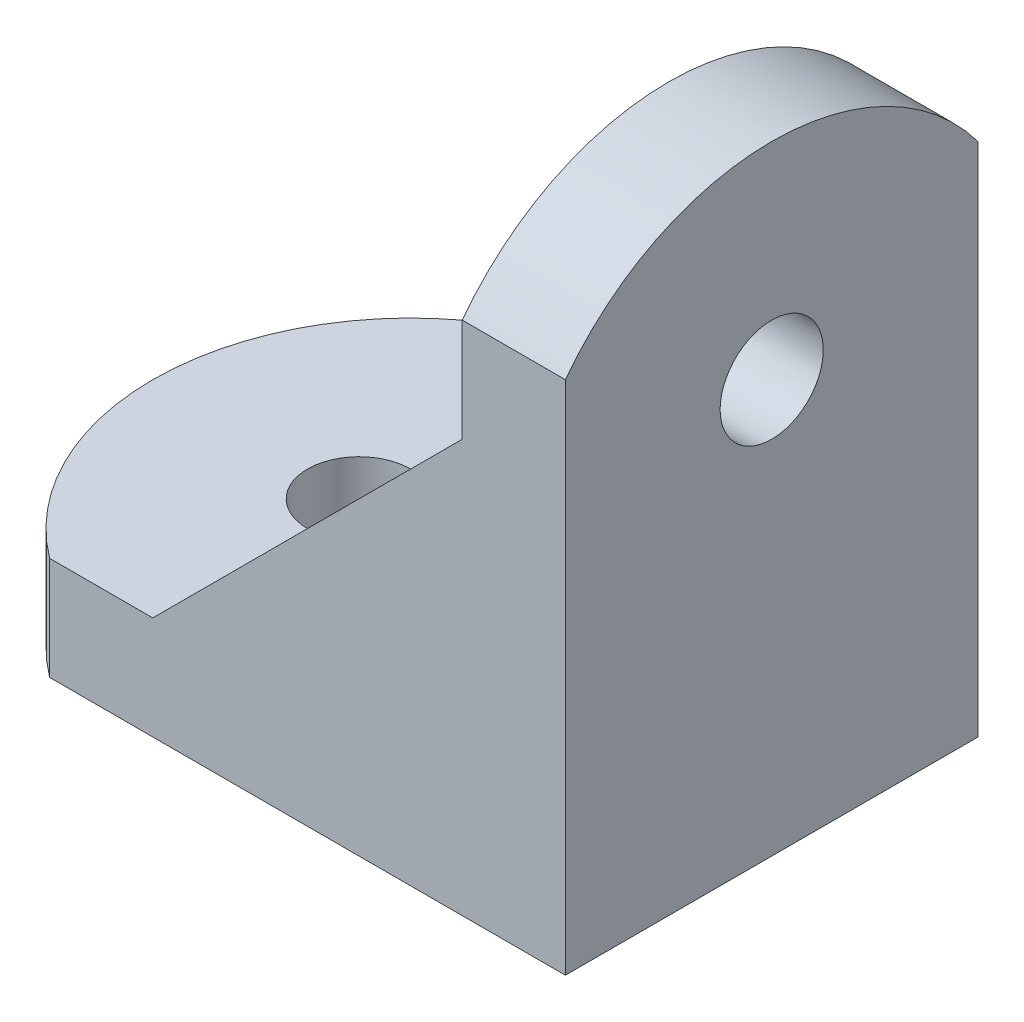
ISO-10303-21;
HEADER;
FILE_DESCRIPTION(('STEP AP214'),'2;1');
FILE_NAME('part.step','',(''),(''),'','','');
FILE_SCHEMA(('AUTOMOTIVE_DESIGN { 1 0 10303 214 1 1 1 1 }'));
ENDSEC;
DATA;
#1=APPLICATION_CONTEXT('core data for automotive mechanical design processes');
#2=APPLICATION_PROTOCOL_DEFINITION('international standard','automotive_design',2000,#1);
#3=PRODUCT_CONTEXT('',#1,'mechanical');
#4=PRODUCT('Part','Part','',(#3));
#5=PRODUCT_RELATED_PRODUCT_CATEGORY('part','',(#4));
#6=PRODUCT_DEFINITION_FORMATION('','',#4);
#7=PRODUCT_DEFINITION_CONTEXT('part definition',#1,'design');
#8=PRODUCT_DEFINITION('design','',#6,#7);
#9=PRODUCT_DEFINITION_SHAPE('','',#8);
#10=(LENGTH_UNIT() NAMED_UNIT(*) SI_UNIT(.MILLI.,.METRE.));
#11=(NAMED_UNIT(*) PLANE_ANGLE_UNIT() SI_UNIT($,.RADIAN.));
#12=(NAMED_UNIT(*) SI_UNIT($,.STERADIAN.) SOLID_ANGLE_UNIT());
#13=UNCERTAINTY_MEASURE_WITH_UNIT(LENGTH_MEASURE(1.E-05),#10,'distance_accuracy_value','');
#14=(GEOMETRIC_REPRESENTATION_CONTEXT(3) GLOBAL_UNCERTAINTY_ASSIGNED_CONTEXT((#13)) GLOBAL_UNIT_ASSIGNED_CONTEXT((#10,
#11,#12)) REPRESENTATION_CONTEXT('',''));
#15=CARTESIAN_POINT('',(0.,0.,0.));
#16=DIRECTION('',(0.,0.,1.));
#17=DIRECTION('',(1.,0.,0.));
#18=AXIS2_PLACEMENT_3D('',#15,#16,#17);
#19=CARTESIAN_POINT('',(0.,0.,0.));
#20=DIRECTION('',(0.,1.,0.));
#21=DIRECTION('',(0.,0.,1.));
#22=AXIS2_PLACEMENT_3D('',#19,#20,#21);
#23=PLANE('',#22);
#24=CARTESIAN_POINT('',(-11.9992417686396,0.,-37.4852212699076));
#25=DIRECTION('',(0.,1.,0.));
#26=DIRECTION('',(0.,0.,1.));
#27=AXIS2_PLACEMENT_3D('',#24,#25,#26);
#28=CIRCLE('',#27,2.5);
#29=CARTESIAN_POINT('',(-11.9992417686396,0.,-34.9852212699076));
#30=VERTEX_POINT('',#29);
#31=EDGE_CURVE('E117',#30,#30,#28,.T.);
#32=ORIENTED_EDGE('',*,*,#31,.T.);
#33=EDGE_LOOP('',(#32));
#34=FACE_BOUND('',#33,.T.);
#35=CARTESIAN_POINT('',(-9.49924176863951,0.,-37.4852212699076));
#36=DIRECTION('',(0.,-1.,0.));
#37=DIRECTION('',(0.,0.,-1.));
#38=AXIS2_PLACEMENT_3D('',#35,#36,#37);
#39=CIRCLE('',#38,12.5);
#40=CARTESIAN_POINT('',(-16.9992417686395,0.,-27.4852212699076));
#41=VERTEX_POINT('',#40);
#42=CARTESIAN_POINT('',(-16.9992417686395,0.,-47.4852212699076));
#43=VERTEX_POINT('',#42);
#44=EDGE_CURVE('E112',#41,#43,#39,.T.);
#45=ORIENTED_EDGE('',*,*,#44,.T.);
#46=DIRECTION('',(-1.,0.,0.));
#47=VECTOR('',#46,1.);
#48=CARTESIAN_POINT('',(-21.9992417686395,0.,-47.4852212699076));
#49=LINE('',#48,#47);
#50=CARTESIAN_POINT('',(8.00075823136045,0.,-47.4852212699076));
#51=VERTEX_POINT('',#50);
#52=EDGE_CURVE('E115',#51,#43,#49,.T.);
#53=ORIENTED_EDGE('',*,*,#52,.F.);
#54=DIRECTION('',(0.,0.,-1.));
#55=VECTOR('',#54,1.);
#56=CARTESIAN_POINT('',(8.00075823136045,0.,-47.4852212699076));
#57=LINE('',#56,#55);
#58=CARTESIAN_POINT('',(8.00075823136046,0.,-27.4852212699076));
#59=VERTEX_POINT('',#58);
#60=EDGE_CURVE('E128',#59,#51,#57,.T.);
#61=ORIENTED_EDGE('',*,*,#60,.F.);
#62=DIRECTION('',(1.,0.,0.));
#63=VECTOR('',#62,1.);
#64=CARTESIAN_POINT('',(-21.9992417686395,0.,-27.4852212699076));
#65=LINE('',#64,#63);
#66=EDGE_CURVE('E116',#41,#59,#65,.T.);
#67=ORIENTED_EDGE('',*,*,#66,.F.);
#68=EDGE_LOOP('',(#45,#53,#61,#67));
#69=FACE_BOUND('',#68,.T.);
#70=ADVANCED_FACE('F34',(#34,#69),#23,.F.);
#71=CARTESIAN_POINT('',(0.,5.,0.));
#72=DIRECTION('',(0.,1.,0.));
#73=DIRECTION('',(0.,0.,1.));
#74=AXIS2_PLACEMENT_3D('',#71,#72,#73);
#75=PLANE('',#74);
#76=CARTESIAN_POINT('',(-11.9992417686396,5.,-37.4852212699076));
#77=DIRECTION('',(0.,1.,0.));
#78=DIRECTION('',(0.,0.,1.));
#79=AXIS2_PLACEMENT_3D('',#76,#77,#78);
#80=CIRCLE('',#79,2.5);
#81=CARTESIAN_POINT('',(-11.9992417686396,5.,-34.9852212699076));
#82=VERTEX_POINT('',#81);
#83=EDGE_CURVE('E247',#82,#82,#80,.T.);
#84=ORIENTED_EDGE('',*,*,#83,.F.);
#85=EDGE_LOOP('',(#84));
#86=FACE_BOUND('',#85,.T.);
#87=DIRECTION('',(1.,0.,0.));
#88=VECTOR('',#87,1.);
#89=CARTESIAN_POINT('',(0.,5.,-47.4852212699076));
#90=LINE('',#89,#88);
#91=CARTESIAN_POINT('',(-16.9992417686395,5.,-47.4852212699076));
#92=VERTEX_POINT('',#91);
#93=CARTESIAN_POINT('',(-11.9992417686395,5.,-47.4852212699076));
#94=VERTEX_POINT('',#93);
#95=EDGE_CURVE('E144',#92,#94,#90,.T.);
#96=ORIENTED_EDGE('',*,*,#95,.F.);
#97=CARTESIAN_POINT('',(-9.49924176863951,5.,-37.4852212699076));
#98=DIRECTION('',(0.,1.,0.));
#99=DIRECTION('',(0.,0.,1.));
#100=AXIS2_PLACEMENT_3D('',#97,#98,#99);
#101=CIRCLE('',#100,12.5);
#102=CARTESIAN_POINT('',(-16.9992417686395,5.,-27.4852212699076));
#103=VERTEX_POINT('',#102);
#104=EDGE_CURVE('E42',#92,#103,#101,.T.);
#105=ORIENTED_EDGE('',*,*,#104,.T.);
#106=DIRECTION('',(1.,0.,0.));
#107=VECTOR('',#106,1.);
#108=CARTESIAN_POINT('',(-21.9992417686395,5.,-27.4852212699076));
#109=LINE('',#108,#107);
#110=CARTESIAN_POINT('',(-11.9992417686395,5.,-27.4852212699076));
#111=VERTEX_POINT('',#110);
#112=EDGE_CURVE('E142',#103,#111,#109,.T.);
#113=ORIENTED_EDGE('',*,*,#112,.T.);
#114=DIRECTION('',(0.,0.,-1.));
#115=VECTOR('',#114,1.);
#116=CARTESIAN_POINT('',(-11.9992417686395,5.,-22.4852212699076));
#117=LINE('',#116,#115);
#118=CARTESIAN_POINT('',(-11.9992417686396,5.,-32.4852212699076));
#119=VERTEX_POINT('',#118);
#120=EDGE_CURVE('E57',#111,#119,#117,.T.);
#121=ORIENTED_EDGE('',*,*,#120,.T.);
#122=DIRECTION('',(-1.,0.,0.));
#123=VECTOR('',#122,1.);
#124=CARTESIAN_POINT('',(0.,5.,-32.4852212699076));
#125=LINE('',#124,#123);
#126=CARTESIAN_POINT('',(3.00075823136045,5.,-32.4852212699076));
#127=VERTEX_POINT('',#126);
#128=EDGE_CURVE('E151',#127,#119,#125,.T.);
#129=ORIENTED_EDGE('',*,*,#128,.F.);
#130=DIRECTION('',(0.,0.,1.));
#131=VECTOR('',#130,1.);
#132=CARTESIAN_POINT('',(3.00075823136045,5.,0.));
#133=LINE('',#132,#131);
#134=CARTESIAN_POINT('',(3.00075823136045,5.,-42.4852212699076));
#135=VERTEX_POINT('',#134);
#136=EDGE_CURVE('E159',#135,#127,#133,.T.);
#137=ORIENTED_EDGE('',*,*,#136,.F.);
#138=DIRECTION('',(1.,0.,0.));
#139=VECTOR('',#138,1.);
#140=CARTESIAN_POINT('',(0.,5.,-42.4852212699076));
#141=LINE('',#140,#139);
#142=CARTESIAN_POINT('',(-11.9992417686395,5.,-42.4852212699076));
#143=VERTEX_POINT('',#142);
#144=EDGE_CURVE('E161',#143,#135,#141,.T.);
#145=ORIENTED_EDGE('',*,*,#144,.F.);
#146=EDGE_CURVE('E187',#143,#94,#117,.T.);
#147=ORIENTED_EDGE('',*,*,#146,.T.);
#148=EDGE_LOOP('',(#96,#105,#113,#121,#129,#137,#145,#147));
#149=FACE_BOUND('',#148,.T.);
#150=ADVANCED_FACE('F141',(#86,#149),#75,.T.);
#151=CARTESIAN_POINT('',(-21.9992417686395,30.,-47.4852212699076));
#152=DIRECTION('',(0.,0.,1.));
#153=DIRECTION('',(1.,0.,0.));
#154=AXIS2_PLACEMENT_3D('',#151,#152,#153);
#155=PLANE('',#154);
#156=DIRECTION('',(0.,-1.,0.));
#157=VECTOR('',#156,1.);
#158=CARTESIAN_POINT('',(-16.9992417686396,25.,-47.4852212699076));
#159=LINE('',#158,#157);
#160=EDGE_CURVE('E11',#92,#43,#159,.T.);
#161=ORIENTED_EDGE('',*,*,#160,.F.);
#162=ORIENTED_EDGE('',*,*,#95,.T.);
#163=DIRECTION('',(0.707106781186548,0.707106781186547,0.));
#164=VECTOR('',#163,1.);
#165=CARTESIAN_POINT('',(-8.49962088431977,8.49962088431978,-47.4852212699076));
#166=LINE('',#165,#164);
#167=CARTESIAN_POINT('',(3.00075823136045,20.,-47.4852212699076));
#168=VERTEX_POINT('',#167);
#169=EDGE_CURVE('E178',#94,#168,#166,.T.);
#170=ORIENTED_EDGE('',*,*,#169,.T.);
#171=DIRECTION('',(0.,-1.,0.));
#172=VECTOR('',#171,1.);
#173=CARTESIAN_POINT('',(3.00075823136045,0.,-47.4852212699076));
#174=LINE('',#173,#172);
#175=CARTESIAN_POINT('',(3.00075823136045,25.,-47.4852212699076));
#176=VERTEX_POINT('',#175);
#177=EDGE_CURVE('E185',#176,#168,#174,.T.);
#178=ORIENTED_EDGE('',*,*,#177,.F.);
#179=DIRECTION('',(1.,0.,0.));
#180=VECTOR('',#179,1.);
#181=CARTESIAN_POINT('',(-16.9992417686395,25.,-47.4852212699076));
#182=LINE('',#181,#180);
#183=CARTESIAN_POINT('',(8.00075823136045,25.,-47.4852212699076));
#184=VERTEX_POINT('',#183);
#185=EDGE_CURVE('E139',#176,#184,#182,.T.);
#186=ORIENTED_EDGE('',*,*,#185,.T.);
#187=DIRECTION('',(0.,-1.,0.));
#188=VECTOR('',#187,1.);
#189=CARTESIAN_POINT('',(8.00075823136045,30.,-47.4852212699076));
#190=LINE('',#189,#188);
#191=EDGE_CURVE('E126',#184,#51,#190,.T.);
#192=ORIENTED_EDGE('',*,*,#191,.T.);
#193=ORIENTED_EDGE('',*,*,#52,.T.);
#194=EDGE_LOOP('',(#161,#162,#170,#178,#186,#192,#193));
#195=FACE_BOUND('',#194,.T.);
#196=ADVANCED_FACE('F123',(#195),#155,.F.);
#197=CARTESIAN_POINT('',(-21.9992417686395,30.,-27.4852212699076));
#198=DIRECTION('',(0.,0.,-1.));
#199=DIRECTION('',(-1.,0.,0.));
#200=AXIS2_PLACEMENT_3D('',#197,#198,#199);
#201=PLANE('',#200);
#202=DIRECTION('',(0.,-1.,0.));
#203=VECTOR('',#202,1.);
#204=CARTESIAN_POINT('',(-16.9992417686395,25.,-27.4852212699076));
#205=LINE('',#204,#203);
#206=EDGE_CURVE('E49',#103,#41,#205,.T.);
#207=ORIENTED_EDGE('',*,*,#206,.T.);
#208=ORIENTED_EDGE('',*,*,#66,.T.);
#209=DIRECTION('',(0.,-1.,0.));
#210=VECTOR('',#209,1.);
#211=CARTESIAN_POINT('',(8.00075823136046,30.,-27.4852212699076));
#212=LINE('',#211,#210);
#213=CARTESIAN_POINT('',(8.00075823136046,25.,-27.4852212699076));
#214=VERTEX_POINT('',#213);
#215=EDGE_CURVE('E130',#214,#59,#212,.T.);
#216=ORIENTED_EDGE('',*,*,#215,.F.);
#217=DIRECTION('',(1.,0.,0.));
#218=VECTOR('',#217,1.);
#219=CARTESIAN_POINT('',(-16.9992417686395,25.,-27.4852212699076));
#220=LINE('',#219,#218);
#221=CARTESIAN_POINT('',(3.00075823136045,25.,-27.4852212699076));
#222=VERTEX_POINT('',#221);
#223=EDGE_CURVE('E176',#222,#214,#220,.T.);
#224=ORIENTED_EDGE('',*,*,#223,.F.);
#225=DIRECTION('',(0.,-1.,0.));
#226=VECTOR('',#225,1.);
#227=CARTESIAN_POINT('',(3.00075823136045,30.,-27.4852212699076));
#228=LINE('',#227,#226);
#229=CARTESIAN_POINT('',(3.00075823136045,20.,-27.4852212699076));
#230=VERTEX_POINT('',#229);
#231=EDGE_CURVE('E149',#222,#230,#228,.T.);
#232=ORIENTED_EDGE('',*,*,#231,.T.);
#233=DIRECTION('',(0.707106781186548,0.707106781186547,0.));
#234=VECTOR('',#233,1.);
#235=CARTESIAN_POINT('',(-4.49924176863955,12.5,-27.4852212699076));
#236=LINE('',#235,#234);
#237=EDGE_CURVE('E148',#111,#230,#236,.T.);
#238=ORIENTED_EDGE('',*,*,#237,.F.);
#239=ORIENTED_EDGE('',*,*,#112,.F.);
#240=EDGE_LOOP('',(#207,#208,#216,#224,#232,#238,#239));
#241=FACE_BOUND('',#240,.T.);
#242=ADVANCED_FACE('F36',(#241),#201,.F.);
#243=CARTESIAN_POINT('',(8.00075823136045,30.,-47.4852212699076));
#244=DIRECTION('',(-1.,0.,0.));
#245=DIRECTION('',(0.,0.,1.));
#246=AXIS2_PLACEMENT_3D('',#243,#244,#245);
#247=PLANE('',#246);
#248=CARTESIAN_POINT('',(8.00075823136045,20.,-37.4852212699076));
#249=DIRECTION('',(-1.,0.,0.));
#250=DIRECTION('',(0.,0.,1.));
#251=AXIS2_PLACEMENT_3D('',#248,#249,#250);
#252=CIRCLE('',#251,2.5);
#253=CARTESIAN_POINT('',(8.00075823136045,20.,-34.9852212699076));
#254=VERTEX_POINT('',#253);
#255=EDGE_CURVE('E245',#254,#254,#252,.T.);
#256=ORIENTED_EDGE('',*,*,#255,.T.);
#257=EDGE_LOOP('',(#256));
#258=FACE_BOUND('',#257,.T.);
#259=ORIENTED_EDGE('',*,*,#191,.F.);
#260=CARTESIAN_POINT('',(8.00075823136045,17.5,-37.4852212699076));
#261=DIRECTION('',(1.,0.,0.));
#262=DIRECTION('',(0.,0.,-1.));
#263=AXIS2_PLACEMENT_3D('',#260,#261,#262);
#264=CIRCLE('',#263,12.5);
#265=EDGE_CURVE('E173',#214,#184,#264,.F.);
#266=ORIENTED_EDGE('',*,*,#265,.F.);
#267=ORIENTED_EDGE('',*,*,#215,.T.);
#268=ORIENTED_EDGE('',*,*,#60,.T.);
#269=EDGE_LOOP('',(#259,#266,#267,#268));
#270=FACE_BOUND('',#269,.T.);
#271=ADVANCED_FACE('F172',(#258,#270),#247,.F.);
#272=CARTESIAN_POINT('',(3.00075823136045,5.,0.));
#273=DIRECTION('',(-1.,0.,0.));
#274=DIRECTION('',(0.,0.,1.));
#275=AXIS2_PLACEMENT_3D('',#272,#273,#274);
#276=PLANE('',#275);
#277=CARTESIAN_POINT('',(3.00075823136045,20.,-37.4852212699076));
#278=DIRECTION('',(-1.,0.,0.));
#279=DIRECTION('',(0.,0.,1.));
#280=AXIS2_PLACEMENT_3D('',#277,#278,#279);
#281=CIRCLE('',#280,2.5);
#282=CARTESIAN_POINT('',(3.00075823136045,20.,-34.9852212699076));
#283=VERTEX_POINT('',#282);
#284=EDGE_CURVE('E248',#283,#283,#281,.T.);
#285=ORIENTED_EDGE('',*,*,#284,.F.);
#286=EDGE_LOOP('',(#285));
#287=FACE_BOUND('',#286,.T.);
#288=CARTESIAN_POINT('',(3.00075823136045,17.5,-37.4852212699076));
#289=DIRECTION('',(-1.,0.,0.));
#290=DIRECTION('',(0.,0.,1.));
#291=AXIS2_PLACEMENT_3D('',#288,#289,#290);
#292=CIRCLE('',#291,12.5);
#293=EDGE_CURVE('E137',#176,#222,#292,.F.);
#294=ORIENTED_EDGE('',*,*,#293,.F.);
#295=ORIENTED_EDGE('',*,*,#177,.T.);
#296=DIRECTION('',(0.,0.,-1.));
#297=VECTOR('',#296,1.);
#298=CARTESIAN_POINT('',(3.00075823136045,20.,-22.4852212699076));
#299=LINE('',#298,#297);
#300=CARTESIAN_POINT('',(3.00075823136045,20.,-42.4852212699076));
#301=VERTEX_POINT('',#300);
#302=EDGE_CURVE('E188',#301,#168,#299,.T.);
#303=ORIENTED_EDGE('',*,*,#302,.F.);
#304=DIRECTION('',(0.,1.,0.));
#305=VECTOR('',#304,1.);
#306=CARTESIAN_POINT('',(3.00075823136045,5.,-42.4852212699076));
#307=LINE('',#306,#305);
#308=EDGE_CURVE('E164',#135,#301,#307,.T.);
#309=ORIENTED_EDGE('',*,*,#308,.F.);
#310=ORIENTED_EDGE('',*,*,#136,.T.);
#311=DIRECTION('',(0.,1.,0.));
#312=VECTOR('',#311,1.);
#313=CARTESIAN_POINT('',(3.00075823136045,5.,-32.4852212699076));
#314=LINE('',#313,#312);
#315=CARTESIAN_POINT('',(3.00075823136045,20.,-32.4852212699076));
#316=VERTEX_POINT('',#315);
#317=EDGE_CURVE('E163',#127,#316,#314,.T.);
#318=ORIENTED_EDGE('',*,*,#317,.T.);
#319=EDGE_CURVE('E191',#230,#316,#299,.T.);
#320=ORIENTED_EDGE('',*,*,#319,.F.);
#321=ORIENTED_EDGE('',*,*,#231,.F.);
#322=EDGE_LOOP('',(#294,#295,#303,#309,#310,#318,#320,#321));
#323=FACE_BOUND('',#322,.T.);
#324=ADVANCED_FACE('F202',(#287,#323),#276,.T.);
#325=CARTESIAN_POINT('',(0.,5.,-32.4852212699076));
#326=DIRECTION('',(0.,0.,-1.));
#327=DIRECTION('',(-1.,0.,0.));
#328=AXIS2_PLACEMENT_3D('',#325,#326,#327);
#329=PLANE('',#328);
#330=ORIENTED_EDGE('',*,*,#128,.T.);
#331=DIRECTION('',(0.707106781186548,0.707106781186547,0.));
#332=VECTOR('',#331,1.);
#333=CARTESIAN_POINT('',(-5.99962088431977,10.9996208843198,-32.4852212699076));
#334=LINE('',#333,#332);
#335=EDGE_CURVE('E153',#119,#316,#334,.T.);
#336=ORIENTED_EDGE('',*,*,#335,.T.);
#337=ORIENTED_EDGE('',*,*,#317,.F.);
#338=EDGE_LOOP('',(#330,#336,#337));
#339=FACE_BOUND('',#338,.T.);
#340=ADVANCED_FACE('F198',(#339),#329,.T.);
#341=CARTESIAN_POINT('',(0.,5.,-42.4852212699076));
#342=DIRECTION('',(0.,0.,1.));
#343=DIRECTION('',(1.,0.,0.));
#344=AXIS2_PLACEMENT_3D('',#341,#342,#343);
#345=PLANE('',#344);
#346=ORIENTED_EDGE('',*,*,#308,.T.);
#347=DIRECTION('',(-0.707106781186548,-0.707106781186547,0.));
#348=VECTOR('',#347,1.);
#349=CARTESIAN_POINT('',(-5.99962088431977,10.9996208843198,-42.4852212699076));
#350=LINE('',#349,#348);
#351=EDGE_CURVE('E193',#301,#143,#350,.T.);
#352=ORIENTED_EDGE('',*,*,#351,.T.);
#353=ORIENTED_EDGE('',*,*,#144,.T.);
#354=EDGE_LOOP('',(#346,#352,#353));
#355=FACE_BOUND('',#354,.T.);
#356=ADVANCED_FACE('F210',(#355),#345,.T.);
#357=CARTESIAN_POINT('',(-8.49962088431977,8.49962088431978,-22.4852212699076));
#358=DIRECTION('',(-0.707106781186547,0.707106781186548,0.));
#359=DIRECTION('',(-0.707106781186548,-0.707106781186547,0.));
#360=AXIS2_PLACEMENT_3D('',#357,#358,#359);
#361=PLANE('',#360);
#362=ORIENTED_EDGE('',*,*,#302,.T.);
#363=ORIENTED_EDGE('',*,*,#169,.F.);
#364=ORIENTED_EDGE('',*,*,#146,.F.);
#365=ORIENTED_EDGE('',*,*,#351,.F.);
#366=EDGE_LOOP('',(#362,#363,#364,#365));
#367=FACE_BOUND('',#366,.T.);
#368=ADVANCED_FACE('F212',(#367),#361,.T.);
#369=ORIENTED_EDGE('',*,*,#237,.T.);
#370=ORIENTED_EDGE('',*,*,#319,.T.);
#371=ORIENTED_EDGE('',*,*,#335,.F.);
#372=ORIENTED_EDGE('',*,*,#120,.F.);
#373=EDGE_LOOP('',(#369,#370,#371,#372));
#374=FACE_BOUND('',#373,.T.);
#375=ADVANCED_FACE('F215',(#374),#361,.T.);
#376=CARTESIAN_POINT('',(-16.9992417686395,17.5,-37.4852212699076));
#377=DIRECTION('',(1.,0.,0.));
#378=DIRECTION('',(0.,0.,-1.));
#379=AXIS2_PLACEMENT_3D('',#376,#377,#378);
#380=CYLINDRICAL_SURFACE('',#379,12.5);
#381=ORIENTED_EDGE('',*,*,#293,.T.);
#382=ORIENTED_EDGE('',*,*,#223,.T.);
#383=ORIENTED_EDGE('',*,*,#265,.T.);
#384=ORIENTED_EDGE('',*,*,#185,.F.);
#385=EDGE_LOOP('',(#381,#382,#383,#384));
#386=FACE_BOUND('',#385,.T.);
#387=ADVANCED_FACE('F214',(#386),#380,.T.);
#388=CARTESIAN_POINT('',(-9.49924176863951,25.,-37.4852212699076));
#389=DIRECTION('',(0.,-1.,0.));
#390=DIRECTION('',(0.,0.,-1.));
#391=AXIS2_PLACEMENT_3D('',#388,#389,#390);
#392=CYLINDRICAL_SURFACE('',#391,12.5);
#393=ORIENTED_EDGE('',*,*,#104,.F.);
#394=ORIENTED_EDGE('',*,*,#160,.T.);
#395=ORIENTED_EDGE('',*,*,#44,.F.);
#396=ORIENTED_EDGE('',*,*,#206,.F.);
#397=EDGE_LOOP('',(#393,#394,#395,#396));
#398=FACE_BOUND('',#397,.T.);
#399=ADVANCED_FACE('F120',(#398),#392,.T.);
#400=CARTESIAN_POINT('',(-11.9992417686396,-20.,-37.4852212699076));
#401=DIRECTION('',(0.,1.,0.));
#402=DIRECTION('',(0.,0.,1.));
#403=AXIS2_PLACEMENT_3D('',#400,#401,#402);
#404=CYLINDRICAL_SURFACE('',#403,2.5);
#405=ORIENTED_EDGE('',*,*,#83,.T.);
#406=EDGE_LOOP('',(#405));
#407=FACE_BOUND('',#406,.T.);
#408=ORIENTED_EDGE('',*,*,#31,.F.);
#409=EDGE_LOOP('',(#408));
#410=FACE_BOUND('',#409,.T.);
#411=ADVANCED_FACE('F257',(#407,#410),#404,.F.);
#412=CARTESIAN_POINT('',(28.0007582313605,20.,-37.4852212699076));
#413=DIRECTION('',(-1.,0.,0.));
#414=DIRECTION('',(0.,0.,1.));
#415=AXIS2_PLACEMENT_3D('',#412,#413,#414);
#416=CYLINDRICAL_SURFACE('',#415,2.5);
#417=ORIENTED_EDGE('',*,*,#284,.T.);
#418=EDGE_LOOP('',(#417));
#419=FACE_BOUND('',#418,.T.);
#420=ORIENTED_EDGE('',*,*,#255,.F.);
#421=EDGE_LOOP('',(#420));
#422=FACE_BOUND('',#421,.T.);
#423=ADVANCED_FACE('F259',(#419,#422),#416,.F.);
#424=CLOSED_SHELL('',(#70,#150,#196,#242,#271,#324,#340,#356,#368,#375,#387,#399,#411,#423));
#425=MANIFOLD_SOLID_BREP('B2',#424);
#426=ADVANCED_BREP_SHAPE_REPRESENTATION('',(#18,#425),#14);
#427=SHAPE_DEFINITION_REPRESENTATION(#9,#426);
ENDSEC;
END-ISO-10303-21;
